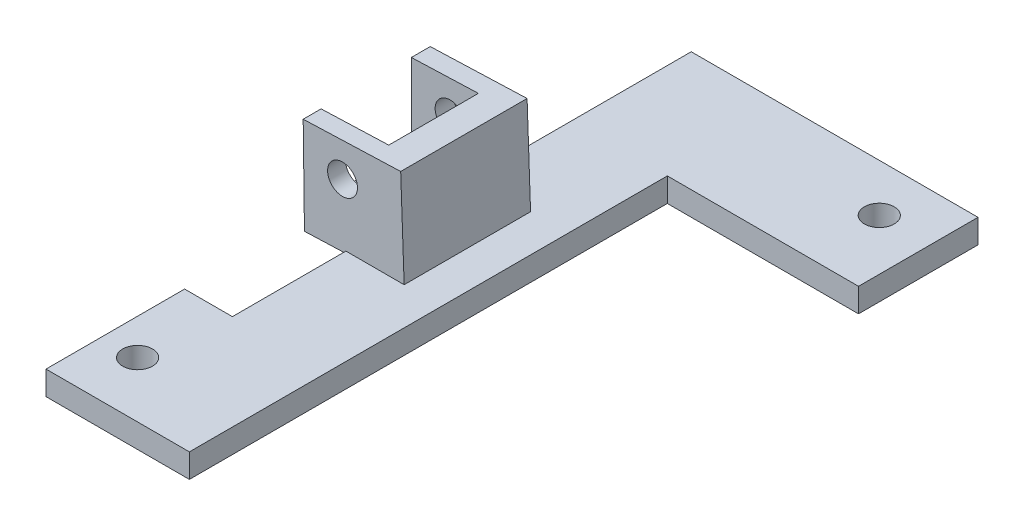
ISO-10303-21;
HEADER;
FILE_DESCRIPTION(('STEP AP214'),'2;1');
FILE_NAME('part.step','',(''),(''),'','','');
FILE_SCHEMA(('AUTOMOTIVE_DESIGN { 1 0 10303 214 1 1 1 1 }'));
ENDSEC;
DATA;
#1=APPLICATION_CONTEXT('core data for automotive mechanical design processes');
#2=APPLICATION_PROTOCOL_DEFINITION('international standard','automotive_design',2000,#1);
#3=PRODUCT_CONTEXT('',#1,'mechanical');
#4=PRODUCT('Part','Part','',(#3));
#5=PRODUCT_RELATED_PRODUCT_CATEGORY('part','',(#4));
#6=PRODUCT_DEFINITION_FORMATION('','',#4);
#7=PRODUCT_DEFINITION_CONTEXT('part definition',#1,'design');
#8=PRODUCT_DEFINITION('design','',#6,#7);
#9=PRODUCT_DEFINITION_SHAPE('','',#8);
#10=(LENGTH_UNIT() NAMED_UNIT(*) SI_UNIT(.MILLI.,.METRE.));
#11=(NAMED_UNIT(*) PLANE_ANGLE_UNIT() SI_UNIT($,.RADIAN.));
#12=(NAMED_UNIT(*) SI_UNIT($,.STERADIAN.) SOLID_ANGLE_UNIT());
#13=UNCERTAINTY_MEASURE_WITH_UNIT(LENGTH_MEASURE(1.E-05),#10,'distance_accuracy_value','');
#14=(GEOMETRIC_REPRESENTATION_CONTEXT(3) GLOBAL_UNCERTAINTY_ASSIGNED_CONTEXT((#13)) GLOBAL_UNIT_ASSIGNED_CONTEXT((#10,
#11,#12)) REPRESENTATION_CONTEXT('',''));
#15=CARTESIAN_POINT('',(0.,0.,0.));
#16=DIRECTION('',(0.,0.,1.));
#17=DIRECTION('',(1.,0.,0.));
#18=AXIS2_PLACEMENT_3D('',#15,#16,#17);
#19=CARTESIAN_POINT('',(346.144684743953,110.000000000002,-23.061761583511));
#20=DIRECTION('',(0.,0.,1.));
#21=DIRECTION('',(1.,0.,0.));
#22=AXIS2_PLACEMENT_3D('',#19,#20,#21);
#23=CYLINDRICAL_SURFACE('',#22,9.525);
#24=DIRECTION('',(0.,0.,1.));
#25=VECTOR('',#24,1.);
#26=CARTESIAN_POINT('',(352.162161706517,117.383467749306,-23.061761583511));
#27=LINE('',#26,#25);
#28=CARTESIAN_POINT('',(352.162161706517,117.383467749306,-19.0500000000003));
#29=VERTEX_POINT('',#28);
#30=CARTESIAN_POINT('',(352.162161706517,117.383467749306,0.));
#31=VERTEX_POINT('',#30);
#32=EDGE_CURVE('E328',#29,#31,#27,.T.);
#33=ORIENTED_EDGE('',*,*,#32,.F.);
#34=CARTESIAN_POINT('',(346.144684743953,110.000000000002,-19.0500000000003));
#35=DIRECTION('',(0.,0.,1.));
#36=DIRECTION('',(1.,0.,0.));
#37=AXIS2_PLACEMENT_3D('',#34,#35,#36);
#38=CIRCLE('',#37,9.525);
#39=CARTESIAN_POINT('',(346.486451601042,100.48113344902,-19.0500000000003));
#40=VERTEX_POINT('',#39);
#41=EDGE_CURVE('E297',#40,#29,#38,.T.);
#42=ORIENTED_EDGE('',*,*,#41,.F.);
#43=DIRECTION('',(0.,0.,1.));
#44=VECTOR('',#43,1.);
#45=CARTESIAN_POINT('',(346.486451601042,100.48113344902,-23.061761583511));
#46=LINE('',#45,#44);
#47=CARTESIAN_POINT('',(346.486451601042,100.48113344902,0.));
#48=VERTEX_POINT('',#47);
#49=EDGE_CURVE('E320',#40,#48,#46,.T.);
#50=ORIENTED_EDGE('',*,*,#49,.T.);
#51=CARTESIAN_POINT('',(346.144684743953,110.000000000002,0.));
#52=DIRECTION('',(0.,0.,1.));
#53=DIRECTION('',(1.,0.,0.));
#54=AXIS2_PLACEMENT_3D('',#51,#52,#53);
#55=CIRCLE('',#54,9.525);
#56=EDGE_CURVE('E296',#48,#31,#55,.T.);
#57=ORIENTED_EDGE('',*,*,#56,.T.);
#58=EDGE_LOOP('',(#33,#42,#50,#57));
#59=FACE_BOUND('',#58,.T.);
#60=ADVANCED_FACE('F41',(#59),#23,.F.);
#61=CARTESIAN_POINT('',(-3.75573745735037,104.604536441931,-23.061761583511));
#62=DIRECTION('',(-0.0358810348650173,0.999356068344519,0.));
#63=DIRECTION('',(-0.999356068344519,-0.0358810348650173,0.));
#64=AXIS2_PLACEMENT_3D('',#61,#62,#63);
#65=PLANE('',#64);
#66=ORIENTED_EDGE('',*,*,#32,.T.);
#67=DIRECTION('',(-0.999356068344519,-0.0358810348650153,0.));
#68=VECTOR('',#67,1.);
#69=CARTESIAN_POINT('',(358.508072740506,117.611312320699,0.));
#70=LINE('',#69,#68);
#71=CARTESIAN_POINT('',(337.780813741455,116.867117607364,0.));
#72=VERTEX_POINT('',#71);
#73=EDGE_CURVE('E261',#31,#72,#70,.T.);
#74=ORIENTED_EDGE('',*,*,#73,.T.);
#75=DIRECTION('',(0.,0.,-1.));
#76=VECTOR('',#75,1.);
#77=CARTESIAN_POINT('',(337.780813741455,116.867117607364,3.81));
#78=LINE('',#77,#76);
#79=CARTESIAN_POINT('',(337.780813741455,116.867117607364,3.81));
#80=VERTEX_POINT('',#79);
#81=EDGE_CURVE('E283',#80,#72,#78,.T.);
#82=ORIENTED_EDGE('',*,*,#81,.F.);
#83=DIRECTION('',(-0.999356068344519,-0.0358810348650153,0.));
#84=VECTOR('',#83,1.);
#85=CARTESIAN_POINT('',(358.508072740506,117.611312320699,3.81));
#86=LINE('',#85,#84);
#87=CARTESIAN_POINT('',(358.508072740506,117.611312320699,3.81));
#88=VERTEX_POINT('',#87);
#89=EDGE_CURVE('E264',#88,#80,#86,.T.);
#90=ORIENTED_EDGE('',*,*,#89,.F.);
#91=DIRECTION('',(0.,0.,1.));
#92=VECTOR('',#91,1.);
#93=CARTESIAN_POINT('',(358.508072740504,117.611312320699,-23.061761583511));
#94=LINE('',#93,#92);
#95=CARTESIAN_POINT('',(358.508072740504,117.611312320699,-23.061761583511));
#96=VERTEX_POINT('',#95);
#97=EDGE_CURVE('E330',#96,#88,#94,.T.);
#98=ORIENTED_EDGE('',*,*,#97,.F.);
#99=DIRECTION('',(-0.999356068344519,-0.0358810348650173,0.));
#100=VECTOR('',#99,1.);
#101=CARTESIAN_POINT('',(-3.75573745735037,104.604536441931,-23.061761583511));
#102=LINE('',#101,#100);
#103=CARTESIAN_POINT('',(337.915550260548,116.871955208187,-23.061761583511));
#104=VERTEX_POINT('',#103);
#105=EDGE_CURVE('E318',#96,#104,#102,.T.);
#106=ORIENTED_EDGE('',*,*,#105,.T.);
#107=DIRECTION('',(0.,0.,-1.));
#108=VECTOR('',#107,1.);
#109=CARTESIAN_POINT('',(337.915550260548,116.871955208187,5.67641578914084));
#110=LINE('',#109,#108);
#111=CARTESIAN_POINT('',(337.915550260548,116.871955208187,-19.0500000000003));
#112=VERTEX_POINT('',#111);
#113=EDGE_CURVE('E286',#112,#104,#110,.T.);
#114=ORIENTED_EDGE('',*,*,#113,.F.);
#115=DIRECTION('',(-0.999356068344519,-0.0358810348650149,0.));
#116=VECTOR('',#115,1.);
#117=CARTESIAN_POINT('',(-3.75573745735016,104.604536441932,-19.0500000000003));
#118=LINE('',#117,#116);
#119=EDGE_CURVE('E292',#29,#112,#118,.T.);
#120=ORIENTED_EDGE('',*,*,#119,.F.);
#121=EDGE_LOOP('',(#66,#74,#82,#90,#98,#106,#114,#120));
#122=FACE_BOUND('',#121,.T.);
#123=ADVANCED_FACE('F416',(#122),#65,.T.);
#124=CARTESIAN_POINT('',(362.263810197855,13.0067758787662,-23.061761583511));
#125=DIRECTION('',(0.999356068344519,0.0358810348650144,0.));
#126=DIRECTION('',(-0.0358810348650144,0.99935606834452,0.));
#127=AXIS2_PLACEMENT_3D('',#124,#125,#126);
#128=PLANE('',#127);
#129=ORIENTED_EDGE('',*,*,#97,.T.);
#130=DIRECTION('',(-0.0358810348650144,0.999356068344519,0.));
#131=VECTOR('',#130,1.);
#132=CARTESIAN_POINT('',(359.243555016962,97.1267115029865,3.81));
#133=LINE('',#132,#131);
#134=CARTESIAN_POINT('',(359.243555016962,97.1267115029865,3.81));
#135=VERTEX_POINT('',#134);
#136=EDGE_CURVE('E273',#135,#88,#133,.T.);
#137=ORIENTED_EDGE('',*,*,#136,.F.);
#138=DIRECTION('',(0.,0.,1.));
#139=VECTOR('',#138,1.);
#140=CARTESIAN_POINT('',(359.243555016961,97.1267115029865,-23.061761583511));
#141=LINE('',#140,#139);
#142=CARTESIAN_POINT('',(359.243555016961,97.1267115029865,-23.061761583511));
#143=VERTEX_POINT('',#142);
#144=EDGE_CURVE('E332',#143,#135,#141,.T.);
#145=ORIENTED_EDGE('',*,*,#144,.F.);
#146=DIRECTION('',(-0.0358810348650144,0.999356068344519,0.));
#147=VECTOR('',#146,1.);
#148=CARTESIAN_POINT('',(362.263810197855,13.0067758787662,-23.061761583511));
#149=LINE('',#148,#147);
#150=EDGE_CURVE('E315',#143,#96,#149,.T.);
#151=ORIENTED_EDGE('',*,*,#150,.T.);
#152=EDGE_LOOP('',(#129,#137,#145,#151));
#153=FACE_BOUND('',#152,.T.);
#154=ADVANCED_FACE('F422',(#153),#128,.T.);
#155=CARTESIAN_POINT('',(-3.02025518089423,84.1199356242191,-23.061761583511));
#156=DIRECTION('',(0.0358810348650174,-0.999356068344519,0.));
#157=DIRECTION('',(0.999356068344519,0.0358810348650174,0.));
#158=AXIS2_PLACEMENT_3D('',#155,#156,#157);
#159=PLANE('',#158);
#160=DIRECTION('',(0.,0.,-1.));
#161=VECTOR('',#160,1.);
#162=CARTESIAN_POINT('',(346.864506182946,96.6822522187748,-23.0617615835113));
#163=LINE('',#162,#161);
#164=CARTESIAN_POINT('',(346.864506182946,96.6822522187747,3.81));
#165=VERTEX_POINT('',#164);
#166=CARTESIAN_POINT('',(346.864506182946,96.6822522187748,-23.061761583511));
#167=VERTEX_POINT('',#166);
#168=EDGE_CURVE('E253',#165,#167,#163,.T.);
#169=ORIENTED_EDGE('',*,*,#168,.F.);
#170=DIRECTION('',(0.999356068344519,0.0358810348650187,0.));
#171=VECTOR('',#170,1.);
#172=CARTESIAN_POINT('',(338.052257003384,96.3658558610933,3.81));
#173=LINE('',#172,#171);
#174=CARTESIAN_POINT('',(338.052257003384,96.3658558610933,3.81));
#175=VERTEX_POINT('',#174);
#176=EDGE_CURVE('E270',#175,#165,#173,.T.);
#177=ORIENTED_EDGE('',*,*,#176,.F.);
#178=DIRECTION('',(0.,0.,-1.));
#179=VECTOR('',#178,1.);
#180=CARTESIAN_POINT('',(338.052257003384,96.3658558610933,3.81));
#181=LINE('',#180,#179);
#182=CARTESIAN_POINT('',(338.052257003384,96.3658558610933,0.));
#183=VERTEX_POINT('',#182);
#184=EDGE_CURVE('E276',#175,#183,#181,.T.);
#185=ORIENTED_EDGE('',*,*,#184,.T.);
#186=DIRECTION('',(0.,0.,1.));
#187=VECTOR('',#186,1.);
#188=CARTESIAN_POINT('',(338.052257003383,96.3658558610933,-23.061761583511));
#189=LINE('',#188,#187);
#190=CARTESIAN_POINT('',(338.052257003383,96.3658558610933,-23.061761583511));
#191=VERTEX_POINT('',#190);
#192=EDGE_CURVE('E335',#191,#183,#189,.T.);
#193=ORIENTED_EDGE('',*,*,#192,.F.);
#194=DIRECTION('',(0.999356068344519,0.0358810348650174,0.));
#195=VECTOR('',#194,1.);
#196=CARTESIAN_POINT('',(-3.02025518089423,84.1199356242191,-23.061761583511));
#197=LINE('',#196,#195);
#198=EDGE_CURVE('E312',#191,#167,#197,.T.);
#199=ORIENTED_EDGE('',*,*,#198,.T.);
#200=EDGE_LOOP('',(#169,#177,#185,#193,#199));
#201=FACE_BOUND('',#200,.T.);
#202=ADVANCED_FACE('F353',(#201),#159,.T.);
#203=CARTESIAN_POINT('',(341.072512184277,12.245920236874,-23.061761583511));
#204=DIRECTION('',(-0.999356068344519,-0.0358810348650171,0.));
#205=DIRECTION('',(0.0358810348650171,-0.999356068344519,0.));
#206=AXIS2_PLACEMENT_3D('',#203,#204,#205);
#207=PLANE('',#206);
#208=DIRECTION('',(0.0358810348650171,-0.999356068344519,0.));
#209=VECTOR('',#208,1.);
#210=CARTESIAN_POINT('',(341.072512184277,12.245920236874,0.));
#211=LINE('',#210,#209);
#212=CARTESIAN_POINT('',(337.915550260547,100.173402481486,0.));
#213=VERTEX_POINT('',#212);
#214=EDGE_CURVE('E313',#213,#183,#211,.T.);
#215=ORIENTED_EDGE('',*,*,#214,.F.);
#216=DIRECTION('',(0.,0.,1.));
#217=VECTOR('',#216,1.);
#218=CARTESIAN_POINT('',(337.915550260547,100.173402481486,-23.061761583511));
#219=LINE('',#218,#217);
#220=CARTESIAN_POINT('',(337.915550260547,100.173402481486,-19.0500000000003));
#221=VERTEX_POINT('',#220);
#222=EDGE_CURVE('E340',#221,#213,#219,.T.);
#223=ORIENTED_EDGE('',*,*,#222,.F.);
#224=CARTESIAN_POINT('',(337.915550260547,100.173402481486,-23.061761583511));
#225=VERTEX_POINT('',#224);
#226=EDGE_CURVE('E338',#225,#221,#219,.T.);
#227=ORIENTED_EDGE('',*,*,#226,.F.);
#228=DIRECTION('',(0.0358810348650171,-0.999356068344519,0.));
#229=VECTOR('',#228,1.);
#230=CARTESIAN_POINT('',(341.072512184277,12.245920236874,-23.061761583511));
#231=LINE('',#230,#229);
#232=EDGE_CURVE('E309',#225,#191,#231,.T.);
#233=ORIENTED_EDGE('',*,*,#232,.T.);
#234=ORIENTED_EDGE('',*,*,#192,.T.);
#235=EDGE_LOOP('',(#215,#223,#227,#233,#234));
#236=FACE_BOUND('',#235,.T.);
#237=ADVANCED_FACE('F442',(#236),#207,.T.);
#238=CARTESIAN_POINT('',(-3.15696192372979,87.9274822446124,-23.061761583511));
#239=DIRECTION('',(0.0358810348650153,-0.999356068344519,0.));
#240=DIRECTION('',(0.999356068344519,0.0358810348650153,0.));
#241=AXIS2_PLACEMENT_3D('',#238,#239,#240);
#242=PLANE('',#241);
#243=ORIENTED_EDGE('',*,*,#49,.F.);
#244=DIRECTION('',(0.999356068344519,0.0358810348650153,0.));
#245=VECTOR('',#244,1.);
#246=CARTESIAN_POINT('',(-3.15696192372979,87.9274822446124,-19.0500000000003));
#247=LINE('',#246,#245);
#248=EDGE_CURVE('E300',#221,#40,#247,.T.);
#249=ORIENTED_EDGE('',*,*,#248,.F.);
#250=ORIENTED_EDGE('',*,*,#222,.T.);
#251=DIRECTION('',(0.999356068344519,0.0358810348650153,0.));
#252=VECTOR('',#251,1.);
#253=CARTESIAN_POINT('',(-3.15696192372979,87.9274822446124,0.));
#254=LINE('',#253,#252);
#255=CARTESIAN_POINT('',(338.001802865479,100.176499308355,0.));
#256=VERTEX_POINT('',#255);
#257=EDGE_CURVE('E324',#213,#256,#254,.T.);
#258=ORIENTED_EDGE('',*,*,#257,.T.);
#259=EDGE_CURVE('E323',#256,#48,#254,.T.);
#260=ORIENTED_EDGE('',*,*,#259,.T.);
#261=EDGE_LOOP('',(#243,#249,#250,#258,#260));
#262=FACE_BOUND('',#261,.T.);
#263=ADVANCED_FACE('F438',(#262),#242,.F.);
#264=CARTESIAN_POINT('',(0.,0.,-23.061761583511));
#265=DIRECTION('',(0.,0.,1.));
#266=DIRECTION('',(1.,0.,0.));
#267=AXIS2_PLACEMENT_3D('',#264,#265,#266);
#268=PLANE('',#267);
#269=DIRECTION('',(1.,0.,0.));
#270=VECTOR('',#269,1.);
#271=CARTESIAN_POINT('',(0.,97.1267115029864,-23.061761583511));
#272=LINE('',#271,#270);
#273=CARTESIAN_POINT('',(346.864506182946,97.1267115029865,-23.061761583511));
#274=VERTEX_POINT('',#273);
#275=EDGE_CURVE('E55',#274,#143,#272,.T.);
#276=ORIENTED_EDGE('',*,*,#275,.F.);
#277=DIRECTION('',(0.,-1.,0.));
#278=VECTOR('',#277,1.);
#279=CARTESIAN_POINT('',(346.864506182946,0.,-23.061761583511));
#280=LINE('',#279,#278);
#281=EDGE_CURVE('E59',#274,#167,#280,.T.);
#282=ORIENTED_EDGE('',*,*,#281,.T.);
#283=ORIENTED_EDGE('',*,*,#198,.F.);
#284=ORIENTED_EDGE('',*,*,#232,.F.);
#285=DIRECTION('',(0.,-1.,0.));
#286=VECTOR('',#285,1.);
#287=CARTESIAN_POINT('',(337.915550260548,0.,-23.061761583511));
#288=LINE('',#287,#286);
#289=EDGE_CURVE('E287',#104,#225,#288,.T.);
#290=ORIENTED_EDGE('',*,*,#289,.F.);
#291=ORIENTED_EDGE('',*,*,#105,.F.);
#292=ORIENTED_EDGE('',*,*,#150,.F.);
#293=EDGE_LOOP('',(#276,#282,#283,#284,#290,#291,#292));
#294=FACE_BOUND('',#293,.T.);
#295=CARTESIAN_POINT('',(346.144684743953,110.000000000002,-23.061761583511));
#296=DIRECTION('',(0.,0.,-1.));
#297=DIRECTION('',(-1.,0.,0.));
#298=AXIS2_PLACEMENT_3D('',#295,#296,#297);
#299=CIRCLE('',#298,3.17499999999986);
#300=CARTESIAN_POINT('',(342.969684743953,110.000000000002,-23.061761583511));
#301=VERTEX_POINT('',#300);
#302=EDGE_CURVE('E289',#301,#301,#299,.T.);
#303=ORIENTED_EDGE('',*,*,#302,.F.);
#304=EDGE_LOOP('',(#303));
#305=FACE_BOUND('',#304,.T.);
#306=ADVANCED_FACE('F453',(#294,#305),#268,.F.);
#307=CARTESIAN_POINT('',(0.,0.,0.));
#308=DIRECTION('',(0.,0.,1.));
#309=DIRECTION('',(1.,0.,0.));
#310=AXIS2_PLACEMENT_3D('',#307,#308,#309);
#311=PLANE('',#310);
#312=DIRECTION('',(0.0132391594034909,-0.999912358488627,0.));
#313=VECTOR('',#312,1.);
#314=CARTESIAN_POINT('',(337.780813741455,116.867117607364,0.));
#315=LINE('',#314,#313);
#316=EDGE_CURVE('E280',#256,#183,#315,.T.);
#317=ORIENTED_EDGE('',*,*,#316,.F.);
#318=ORIENTED_EDGE('',*,*,#257,.F.);
#319=ORIENTED_EDGE('',*,*,#214,.T.);
#320=EDGE_LOOP('',(#317,#318,#319));
#321=FACE_BOUND('',#320,.T.);
#322=ADVANCED_FACE('F444',(#321),#311,.T.);
#323=CARTESIAN_POINT('',(337.915550260548,0.,5.67641578914084));
#324=DIRECTION('',(1.,0.,0.));
#325=DIRECTION('',(0.,0.,-1.));
#326=AXIS2_PLACEMENT_3D('',#323,#324,#325);
#327=PLANE('',#326);
#328=DIRECTION('',(0.,-1.,0.));
#329=VECTOR('',#328,1.);
#330=CARTESIAN_POINT('',(337.915550260548,0.,-19.0500000000003));
#331=LINE('',#330,#329);
#332=EDGE_CURVE('E302',#112,#221,#331,.T.);
#333=ORIENTED_EDGE('',*,*,#332,.F.);
#334=ORIENTED_EDGE('',*,*,#113,.T.);
#335=ORIENTED_EDGE('',*,*,#289,.T.);
#336=ORIENTED_EDGE('',*,*,#226,.T.);
#337=EDGE_LOOP('',(#333,#334,#335,#336));
#338=FACE_BOUND('',#337,.T.);
#339=ADVANCED_FACE('F456',(#338),#327,.F.);
#340=CARTESIAN_POINT('',(346.144684743953,110.000000000002,5.67641578914084));
#341=DIRECTION('',(0.,0.,-1.));
#342=DIRECTION('',(-1.,0.,0.));
#343=AXIS2_PLACEMENT_3D('',#340,#341,#342);
#344=CYLINDRICAL_SURFACE('',#343,3.17499999999986);
#345=ORIENTED_EDGE('',*,*,#302,.T.);
#346=EDGE_LOOP('',(#345));
#347=FACE_BOUND('',#346,.T.);
#348=CARTESIAN_POINT('',(346.144684743953,110.000000000002,-19.0500000000003));
#349=DIRECTION('',(0.,0.,1.));
#350=DIRECTION('',(1.,0.,0.));
#351=AXIS2_PLACEMENT_3D('',#348,#349,#350);
#352=CIRCLE('',#351,3.17499999999986);
#353=CARTESIAN_POINT('',(349.319684743953,110.000000000002,-19.0500000000003));
#354=VERTEX_POINT('',#353);
#355=EDGE_CURVE('E293',#354,#354,#352,.F.);
#356=ORIENTED_EDGE('',*,*,#355,.F.);
#357=EDGE_LOOP('',(#356));
#358=FACE_BOUND('',#357,.T.);
#359=ADVANCED_FACE('F458',(#347,#358),#344,.F.);
#360=CARTESIAN_POINT('',(314.158120897483,116.018964789375,-19.0500000000003));
#361=DIRECTION('',(0.,0.,1.));
#362=DIRECTION('',(1.,0.,0.));
#363=AXIS2_PLACEMENT_3D('',#360,#361,#362);
#364=PLANE('',#363);
#365=ORIENTED_EDGE('',*,*,#119,.T.);
#366=ORIENTED_EDGE('',*,*,#332,.T.);
#367=ORIENTED_EDGE('',*,*,#248,.T.);
#368=ORIENTED_EDGE('',*,*,#41,.T.);
#369=EDGE_LOOP('',(#365,#366,#367,#368));
#370=FACE_BOUND('',#369,.T.);
#371=ORIENTED_EDGE('',*,*,#355,.T.);
#372=EDGE_LOOP('',(#371));
#373=FACE_BOUND('',#372,.T.);
#374=ADVANCED_FACE('F433',(#370,#373),#364,.T.);
#375=CARTESIAN_POINT('',(0.,0.,0.));
#376=DIRECTION('',(0.,0.,-1.));
#377=DIRECTION('',(-1.,0.,0.));
#378=AXIS2_PLACEMENT_3D('',#375,#376,#377);
#379=PLANE('',#378);
#380=CARTESIAN_POINT('',(346.144684743953,110.000000000002,0.));
#381=DIRECTION('',(0.,0.,1.));
#382=DIRECTION('',(1.,0.,0.));
#383=AXIS2_PLACEMENT_3D('',#380,#381,#382);
#384=CIRCLE('',#383,3.17499999999997);
#385=CARTESIAN_POINT('',(342.969684743953,110.000000000002,0.));
#386=VERTEX_POINT('',#385);
#387=EDGE_CURVE('E257',#386,#386,#384,.T.);
#388=ORIENTED_EDGE('',*,*,#387,.T.);
#389=EDGE_LOOP('',(#388));
#390=FACE_BOUND('',#389,.T.);
#391=ORIENTED_EDGE('',*,*,#56,.F.);
#392=ORIENTED_EDGE('',*,*,#259,.F.);
#393=EDGE_CURVE('E268',#72,#256,#315,.T.);
#394=ORIENTED_EDGE('',*,*,#393,.F.);
#395=ORIENTED_EDGE('',*,*,#73,.F.);
#396=EDGE_LOOP('',(#391,#392,#394,#395));
#397=FACE_BOUND('',#396,.T.);
#398=ADVANCED_FACE('F447',(#390,#397),#379,.T.);
#399=CARTESIAN_POINT('',(0.,0.,3.81));
#400=DIRECTION('',(0.,0.,-1.));
#401=DIRECTION('',(-1.,0.,0.));
#402=AXIS2_PLACEMENT_3D('',#399,#400,#401);
#403=PLANE('',#402);
#404=ORIENTED_EDGE('',*,*,#176,.T.);
#405=DIRECTION('',(0.,1.,0.));
#406=VECTOR('',#405,1.);
#407=CARTESIAN_POINT('',(346.864506182946,0.,3.81));
#408=LINE('',#407,#406);
#409=CARTESIAN_POINT('',(346.864506182946,97.1267115029865,3.81));
#410=VERTEX_POINT('',#409);
#411=EDGE_CURVE('E11',#165,#410,#408,.T.);
#412=ORIENTED_EDGE('',*,*,#411,.T.);
#413=DIRECTION('',(-1.,0.,0.));
#414=VECTOR('',#413,1.);
#415=CARTESIAN_POINT('',(0.,97.1267115029864,3.81));
#416=LINE('',#415,#414);
#417=EDGE_CURVE('E48',#135,#410,#416,.T.);
#418=ORIENTED_EDGE('',*,*,#417,.F.);
#419=ORIENTED_EDGE('',*,*,#136,.T.);
#420=ORIENTED_EDGE('',*,*,#89,.T.);
#421=DIRECTION('',(0.0132391594034909,-0.999912358488627,0.));
#422=VECTOR('',#421,1.);
#423=CARTESIAN_POINT('',(337.780813741455,116.867117607364,3.81));
#424=LINE('',#423,#422);
#425=EDGE_CURVE('E267',#80,#175,#424,.T.);
#426=ORIENTED_EDGE('',*,*,#425,.T.);
#427=EDGE_LOOP('',(#404,#412,#418,#419,#420,#426));
#428=FACE_BOUND('',#427,.T.);
#429=CARTESIAN_POINT('',(346.144684743953,110.000000000002,3.81));
#430=DIRECTION('',(0.,0.,1.));
#431=DIRECTION('',(1.,0.,0.));
#432=AXIS2_PLACEMENT_3D('',#429,#430,#431);
#433=CIRCLE('',#432,3.17499999999997);
#434=CARTESIAN_POINT('',(342.969684743953,110.000000000002,3.81));
#435=VERTEX_POINT('',#434);
#436=EDGE_CURVE('E258',#435,#435,#433,.T.);
#437=ORIENTED_EDGE('',*,*,#436,.F.);
#438=EDGE_LOOP('',(#437));
#439=FACE_BOUND('',#438,.T.);
#440=ADVANCED_FACE('F356',(#428,#439),#403,.F.);
#441=CARTESIAN_POINT('',(337.780813741455,116.867117607364,3.81));
#442=DIRECTION('',(0.999912358488627,0.0132391594034909,0.));
#443=DIRECTION('',(-0.0132391594034909,0.999912358488627,0.));
#444=AXIS2_PLACEMENT_3D('',#441,#442,#443);
#445=PLANE('',#444);
#446=ORIENTED_EDGE('',*,*,#393,.T.);
#447=ORIENTED_EDGE('',*,*,#316,.T.);
#448=ORIENTED_EDGE('',*,*,#184,.F.);
#449=ORIENTED_EDGE('',*,*,#425,.F.);
#450=ORIENTED_EDGE('',*,*,#81,.T.);
#451=EDGE_LOOP('',(#446,#447,#448,#449,#450));
#452=FACE_BOUND('',#451,.T.);
#453=ADVANCED_FACE('F347',(#452),#445,.F.);
#454=CARTESIAN_POINT('',(346.144684743953,110.000000000002,3.81));
#455=DIRECTION('',(0.,0.,-1.));
#456=DIRECTION('',(-1.,0.,0.));
#457=AXIS2_PLACEMENT_3D('',#454,#455,#456);
#458=CYLINDRICAL_SURFACE('',#457,3.17499999999997);
#459=CARTESIAN_POINT('',(342.969684743953,110.000000000002,3.81));
#460=CARTESIAN_POINT('',(342.969684743953,110.000000000002,3.7703125));
#461=CARTESIAN_POINT('',(342.969684743953,110.000000000002,3.730625));
#462=CARTESIAN_POINT('',(342.969684743953,110.000000000002,3.65125));
#463=CARTESIAN_POINT('',(342.969684743953,110.000000000002,3.6115625));
#464=CARTESIAN_POINT('',(342.969684743953,110.000000000002,3.5321875));
#465=CARTESIAN_POINT('',(342.969684743953,110.000000000002,3.4925));
#466=CARTESIAN_POINT('',(342.969684743953,110.000000000002,3.413125));
#467=CARTESIAN_POINT('',(342.969684743953,110.000000000002,3.3734375));
#468=CARTESIAN_POINT('',(342.969684743953,110.000000000002,3.2940625));
#469=CARTESIAN_POINT('',(342.969684743953,110.000000000002,3.254375));
#470=CARTESIAN_POINT('',(342.969684743953,110.000000000002,3.175));
#471=CARTESIAN_POINT('',(342.969684743953,110.000000000002,3.1353125));
#472=CARTESIAN_POINT('',(342.969684743953,110.000000000002,3.0559375));
#473=CARTESIAN_POINT('',(342.969684743953,110.000000000002,3.01625));
#474=CARTESIAN_POINT('',(342.969684743953,110.000000000002,2.936875));
#475=CARTESIAN_POINT('',(342.969684743953,110.000000000002,2.8971875));
#476=CARTESIAN_POINT('',(342.969684743953,110.000000000002,2.8178125));
#477=CARTESIAN_POINT('',(342.969684743953,110.000000000002,2.778125));
#478=CARTESIAN_POINT('',(342.969684743953,110.000000000002,2.69875));
#479=CARTESIAN_POINT('',(342.969684743953,110.000000000002,2.6590625));
#480=CARTESIAN_POINT('',(342.969684743953,110.000000000002,2.5796875));
#481=CARTESIAN_POINT('',(342.969684743953,110.000000000002,2.54));
#482=CARTESIAN_POINT('',(342.969684743953,110.000000000002,2.460625));
#483=CARTESIAN_POINT('',(342.969684743953,110.000000000002,2.4209375));
#484=CARTESIAN_POINT('',(342.969684743953,110.000000000002,2.3415625));
#485=CARTESIAN_POINT('',(342.969684743953,110.000000000002,2.301875));
#486=CARTESIAN_POINT('',(342.969684743953,110.000000000002,2.2225));
#487=CARTESIAN_POINT('',(342.969684743953,110.000000000002,2.1828125));
#488=CARTESIAN_POINT('',(342.969684743953,110.000000000002,2.1034375));
#489=CARTESIAN_POINT('',(342.969684743953,110.000000000002,2.06375));
#490=CARTESIAN_POINT('',(342.969684743953,110.000000000002,1.984375));
#491=CARTESIAN_POINT('',(342.969684743953,110.000000000002,1.9446875));
#492=CARTESIAN_POINT('',(342.969684743953,110.000000000002,1.8653125));
#493=CARTESIAN_POINT('',(342.969684743953,110.000000000002,1.825625));
#494=CARTESIAN_POINT('',(342.969684743953,110.000000000002,1.74625));
#495=CARTESIAN_POINT('',(342.969684743953,110.000000000002,1.7065625));
#496=CARTESIAN_POINT('',(342.969684743953,110.000000000002,1.6271875));
#497=CARTESIAN_POINT('',(342.969684743953,110.000000000002,1.5875));
#498=CARTESIAN_POINT('',(342.969684743953,110.000000000002,1.508125));
#499=CARTESIAN_POINT('',(342.969684743953,110.000000000002,1.4684375));
#500=CARTESIAN_POINT('',(342.969684743953,110.000000000002,1.3890625));
#501=CARTESIAN_POINT('',(342.969684743953,110.000000000002,1.349375));
#502=CARTESIAN_POINT('',(342.969684743953,110.000000000002,1.27));
#503=CARTESIAN_POINT('',(342.969684743953,110.000000000002,1.2303125));
#504=CARTESIAN_POINT('',(342.969684743953,110.000000000002,1.1509375));
#505=CARTESIAN_POINT('',(342.969684743953,110.000000000002,1.11125));
#506=CARTESIAN_POINT('',(342.969684743953,110.000000000002,1.031875));
#507=CARTESIAN_POINT('',(342.969684743953,110.000000000002,0.9921875));
#508=CARTESIAN_POINT('',(342.969684743953,110.000000000002,0.9128125));
#509=CARTESIAN_POINT('',(342.969684743953,110.000000000002,0.873125));
#510=CARTESIAN_POINT('',(342.969684743953,110.000000000002,0.79375));
#511=CARTESIAN_POINT('',(342.969684743953,110.000000000002,0.7540625));
#512=CARTESIAN_POINT('',(342.969684743953,110.000000000002,0.6746875));
#513=CARTESIAN_POINT('',(342.969684743953,110.000000000002,0.635));
#514=CARTESIAN_POINT('',(342.969684743953,110.000000000002,0.555625));
#515=CARTESIAN_POINT('',(342.969684743953,110.000000000002,0.5159375));
#516=CARTESIAN_POINT('',(342.969684743953,110.000000000002,0.4365625));
#517=CARTESIAN_POINT('',(342.969684743953,110.000000000002,0.396875));
#518=CARTESIAN_POINT('',(342.969684743953,110.000000000002,0.3175));
#519=CARTESIAN_POINT('',(342.969684743953,110.000000000002,0.2778125));
#520=CARTESIAN_POINT('',(342.969684743953,110.000000000002,0.1984375));
#521=CARTESIAN_POINT('',(342.969684743953,110.000000000002,0.15875));
#522=CARTESIAN_POINT('',(342.969684743953,110.000000000002,0.0793749999999999));
#523=CARTESIAN_POINT('',(342.969684743953,110.000000000002,0.0396874999999999));
#524=CARTESIAN_POINT('',(342.969684743953,110.000000000002,0.));
#525=B_SPLINE_CURVE_WITH_KNOTS('',3,(#459,#460,#461,#462,#463,#464,#465,#466,#467,#468,#469,
#470,#471,#472,#473,#474,#475,#476,#477,#478,#479,#480,#481,#482,#483,#484,#485,#486,#487,#488,
#489,#490,#491,#492,#493,#494,#495,#496,#497,#498,#499,#500,#501,#502,#503,#504,#505,#506,#507,
#508,#509,#510,#511,#512,#513,#514,#515,#516,#517,#518,#519,#520,#521,#522,#523,#524),
.UNSPECIFIED.,.F.,.F.,(4,2,2,2,2,2,2,2,2,2,2,2,2,2,2,2,2,2,2,2,2,2,2,2,2,2,2,2,2,2,2,2,4),(0.,
0.1190625,0.238125,0.3571875,0.47625,0.595312499999999,0.714375,0.833437499999999,
0.952499999999999,1.0715625,1.190625,1.3096875,1.42875,1.5478125,1.666875,1.7859375,1.905,
2.0240625,2.143125,2.2621875,2.38125,2.5003125,2.619375,2.7384375,2.8575,2.9765625,3.095625,
3.2146875,3.33375,3.4528125,3.571875,3.6909375,3.81),.UNSPECIFIED.);
#526=EDGE_CURVE('BSEAM506',#435,#386,#525,.T.);
#527=ORIENTED_EDGE('',*,*,#436,.T.);
#528=ORIENTED_EDGE('',*,*,#387,.F.);
#529=ORIENTED_EDGE('',*,*,#526,.T.);
#530=ORIENTED_EDGE('',*,*,#526,.F.);
#531=EDGE_LOOP('',(#527,#529,#528,#530));
#532=FACE_BOUND('',#531,.T.);
#533=ADVANCED_FACE('F506',(#532),#458,.F.);
#534=CARTESIAN_POINT('',(346.864506182946,92.0467115029864,-44.958));
#535=DIRECTION('',(-1.,0.,0.));
#536=DIRECTION('',(0.,0.,1.));
#537=AXIS2_PLACEMENT_3D('',#534,#535,#536);
#538=PLANE('',#537);
#539=ORIENTED_EDGE('',*,*,#281,.F.);
#540=DIRECTION('',(0.,0.,1.));
#541=VECTOR('',#540,1.);
#542=CARTESIAN_POINT('',(346.864506182946,97.1267115029864,-44.958));
#543=LINE('',#542,#541);
#544=CARTESIAN_POINT('',(346.864506182946,97.1267115029864,-69.596));
#545=VERTEX_POINT('',#544);
#546=EDGE_CURVE('E217',#545,#274,#543,.T.);
#547=ORIENTED_EDGE('',*,*,#546,.F.);
#548=DIRECTION('',(0.,1.,0.));
#549=VECTOR('',#548,1.);
#550=CARTESIAN_POINT('',(346.864506182946,92.0467115029864,-69.596));
#551=LINE('',#550,#549);
#552=CARTESIAN_POINT('',(346.864506182946,92.0467115029864,-69.596));
#553=VERTEX_POINT('',#552);
#554=EDGE_CURVE('E180',#553,#545,#551,.T.);
#555=ORIENTED_EDGE('',*,*,#554,.F.);
#556=DIRECTION('',(0.,0.,1.));
#557=VECTOR('',#556,1.);
#558=CARTESIAN_POINT('',(346.864506182946,92.0467115029864,-44.958));
#559=LINE('',#558,#557);
#560=CARTESIAN_POINT('',(346.864506182946,92.0467115029866,27.94));
#561=VERTEX_POINT('',#560);
#562=EDGE_CURVE('E173',#553,#561,#559,.T.);
#563=ORIENTED_EDGE('',*,*,#562,.T.);
#564=DIRECTION('',(0.,1.,0.));
#565=VECTOR('',#564,1.);
#566=CARTESIAN_POINT('',(346.864506182946,92.0467115029866,27.94));
#567=LINE('',#566,#565);
#568=CARTESIAN_POINT('',(346.864506182946,97.1267115029866,27.94));
#569=VERTEX_POINT('',#568);
#570=EDGE_CURVE('E177',#561,#569,#567,.T.);
#571=ORIENTED_EDGE('',*,*,#570,.T.);
#572=EDGE_CURVE('E220',#410,#569,#543,.T.);
#573=ORIENTED_EDGE('',*,*,#572,.F.);
#574=ORIENTED_EDGE('',*,*,#411,.F.);
#575=ORIENTED_EDGE('',*,*,#168,.T.);
#576=EDGE_LOOP('',(#539,#547,#555,#563,#571,#573,#574,#575));
#577=FACE_BOUND('',#576,.T.);
#578=ADVANCED_FACE('F175',(#577),#538,.T.);
#579=CARTESIAN_POINT('',(0.,97.1267115029864,-2.18833329443828E-13));
#580=DIRECTION('',(0.,-1.,0.));
#581=DIRECTION('',(0.,0.,-1.));
#582=AXIS2_PLACEMENT_3D('',#579,#580,#581);
#583=PLANE('',#582);
#584=CARTESIAN_POINT('',(344.324506182946,97.1267115029866,45.5527908784176));
#585=DIRECTION('',(0.,1.,0.));
#586=DIRECTION('',(0.,0.,1.));
#587=AXIS2_PLACEMENT_3D('',#584,#585,#586);
#588=CIRCLE('',#587,3.17499999999997);
#589=CARTESIAN_POINT('',(344.324506182946,97.1267115029866,48.7277908784176));
#590=VERTEX_POINT('',#589);
#591=EDGE_CURVE('E367',#590,#590,#588,.T.);
#592=ORIENTED_EDGE('',*,*,#591,.F.);
#593=EDGE_LOOP('',(#592));
#594=FACE_BOUND('',#593,.T.);
#595=CARTESIAN_POINT('',(396.977487406266,97.1267115029864,-59.4567827712861));
#596=DIRECTION('',(0.,1.,0.));
#597=DIRECTION('',(0.,0.,1.));
#598=AXIS2_PLACEMENT_3D('',#595,#596,#597);
#599=CIRCLE('',#598,3.17499999999997);
#600=CARTESIAN_POINT('',(396.977487406266,97.1267115029864,-56.2817827712861));
#601=VERTEX_POINT('',#600);
#602=EDGE_CURVE('E360',#601,#601,#599,.T.);
#603=ORIENTED_EDGE('',*,*,#602,.F.);
#604=EDGE_LOOP('',(#603));
#605=FACE_BOUND('',#604,.T.);
#606=ORIENTED_EDGE('',*,*,#546,.T.);
#607=ORIENTED_EDGE('',*,*,#275,.T.);
#608=ORIENTED_EDGE('',*,*,#144,.T.);
#609=ORIENTED_EDGE('',*,*,#417,.T.);
#610=ORIENTED_EDGE('',*,*,#572,.T.);
#611=DIRECTION('',(-1.,0.,0.));
#612=VECTOR('',#611,1.);
#613=CARTESIAN_POINT('',(336.704506182946,97.1267115029866,27.94));
#614=LINE('',#613,#612);
#615=CARTESIAN_POINT('',(336.704506182946,97.1267115029866,27.94));
#616=VERTEX_POINT('',#615);
#617=EDGE_CURVE('E192',#569,#616,#614,.T.);
#618=ORIENTED_EDGE('',*,*,#617,.T.);
#619=DIRECTION('',(0.,0.,1.));
#620=VECTOR('',#619,1.);
#621=CARTESIAN_POINT('',(336.704506182946,97.1267115029866,57.404));
#622=LINE('',#621,#620);
#623=CARTESIAN_POINT('',(336.704506182946,97.1267115029866,57.404));
#624=VERTEX_POINT('',#623);
#625=EDGE_CURVE('E222',#616,#624,#622,.T.);
#626=ORIENTED_EDGE('',*,*,#625,.T.);
#627=DIRECTION('',(1.,0.,0.));
#628=VECTOR('',#627,1.);
#629=CARTESIAN_POINT('',(367.184506182946,97.1267115029866,57.404));
#630=LINE('',#629,#628);
#631=CARTESIAN_POINT('',(367.184506182946,97.1267115029866,57.404));
#632=VERTEX_POINT('',#631);
#633=EDGE_CURVE('E225',#624,#632,#630,.T.);
#634=ORIENTED_EDGE('',*,*,#633,.T.);
#635=DIRECTION('',(0.,0.,-1.));
#636=VECTOR('',#635,1.);
#637=CARTESIAN_POINT('',(367.184506182946,97.1267115029864,-44.196));
#638=LINE('',#637,#636);
#639=CARTESIAN_POINT('',(367.184506182946,97.1267115029864,-44.196));
#640=VERTEX_POINT('',#639);
#641=EDGE_CURVE('E228',#632,#640,#638,.T.);
#642=ORIENTED_EDGE('',*,*,#641,.T.);
#643=DIRECTION('',(1.,0.,0.));
#644=VECTOR('',#643,1.);
#645=CARTESIAN_POINT('',(407.824506182946,97.1267115029864,-44.196));
#646=LINE('',#645,#644);
#647=CARTESIAN_POINT('',(407.824506182946,97.1267115029864,-44.196));
#648=VERTEX_POINT('',#647);
#649=EDGE_CURVE('E231',#640,#648,#646,.T.);
#650=ORIENTED_EDGE('',*,*,#649,.T.);
#651=DIRECTION('',(0.,0.,-1.));
#652=VECTOR('',#651,1.);
#653=CARTESIAN_POINT('',(407.824506182946,97.1267115029864,-69.596));
#654=LINE('',#653,#652);
#655=CARTESIAN_POINT('',(407.824506182946,97.1267115029864,-69.596));
#656=VERTEX_POINT('',#655);
#657=EDGE_CURVE('E234',#648,#656,#654,.T.);
#658=ORIENTED_EDGE('',*,*,#657,.T.);
#659=DIRECTION('',(-1.,0.,0.));
#660=VECTOR('',#659,1.);
#661=CARTESIAN_POINT('',(346.864506182946,97.1267115029864,-69.596));
#662=LINE('',#661,#660);
#663=EDGE_CURVE('E186',#656,#545,#662,.T.);
#664=ORIENTED_EDGE('',*,*,#663,.T.);
#665=EDGE_LOOP('',(#606,#607,#608,#609,#610,#618,#626,#634,#642,#650,#658,#664));
#666=FACE_BOUND('',#665,.T.);
#667=ADVANCED_FACE('F381',(#594,#605,#666),#583,.F.);
#668=CARTESIAN_POINT('',(346.864506182946,92.0467115029864,-69.596));
#669=DIRECTION('',(0.,0.,-1.));
#670=DIRECTION('',(0.,1.,0.));
#671=AXIS2_PLACEMENT_3D('',#668,#669,#670);
#672=PLANE('',#671);
#673=ORIENTED_EDGE('',*,*,#663,.F.);
#674=DIRECTION('',(0.,1.,0.));
#675=VECTOR('',#674,1.);
#676=CARTESIAN_POINT('',(407.824506182946,92.0467115029864,-69.596));
#677=LINE('',#676,#675);
#678=CARTESIAN_POINT('',(407.824506182946,92.0467115029864,-69.596));
#679=VERTEX_POINT('',#678);
#680=EDGE_CURVE('E240',#679,#656,#677,.T.);
#681=ORIENTED_EDGE('',*,*,#680,.F.);
#682=DIRECTION('',(-1.,0.,0.));
#683=VECTOR('',#682,1.);
#684=CARTESIAN_POINT('',(346.864506182946,92.0467115029864,-69.596));
#685=LINE('',#684,#683);
#686=EDGE_CURVE('E194',#679,#553,#685,.T.);
#687=ORIENTED_EDGE('',*,*,#686,.T.);
#688=ORIENTED_EDGE('',*,*,#554,.T.);
#689=EDGE_LOOP('',(#673,#681,#687,#688));
#690=FACE_BOUND('',#689,.T.);
#691=ADVANCED_FACE('F384',(#690),#672,.T.);
#692=CARTESIAN_POINT('',(407.824506182946,92.0467115029864,-69.596));
#693=DIRECTION('',(1.,0.,0.));
#694=DIRECTION('',(0.,1.,0.));
#695=AXIS2_PLACEMENT_3D('',#692,#693,#694);
#696=PLANE('',#695);
#697=ORIENTED_EDGE('',*,*,#657,.F.);
#698=DIRECTION('',(0.,1.,0.));
#699=VECTOR('',#698,1.);
#700=CARTESIAN_POINT('',(407.824506182946,92.0467115029864,-44.196));
#701=LINE('',#700,#699);
#702=CARTESIAN_POINT('',(407.824506182946,92.0467115029864,-44.196));
#703=VERTEX_POINT('',#702);
#704=EDGE_CURVE('E242',#703,#648,#701,.T.);
#705=ORIENTED_EDGE('',*,*,#704,.F.);
#706=DIRECTION('',(0.,0.,-1.));
#707=VECTOR('',#706,1.);
#708=CARTESIAN_POINT('',(407.824506182946,92.0467115029864,-69.596));
#709=LINE('',#708,#707);
#710=EDGE_CURVE('E213',#703,#679,#709,.T.);
#711=ORIENTED_EDGE('',*,*,#710,.T.);
#712=ORIENTED_EDGE('',*,*,#680,.T.);
#713=EDGE_LOOP('',(#697,#705,#711,#712));
#714=FACE_BOUND('',#713,.T.);
#715=ADVANCED_FACE('F406',(#714),#696,.T.);
#716=CARTESIAN_POINT('',(407.824506182946,92.0467115029864,-44.196));
#717=DIRECTION('',(0.,0.,1.));
#718=DIRECTION('',(0.,-1.,0.));
#719=AXIS2_PLACEMENT_3D('',#716,#717,#718);
#720=PLANE('',#719);
#721=ORIENTED_EDGE('',*,*,#649,.F.);
#722=DIRECTION('',(0.,1.,0.));
#723=VECTOR('',#722,1.);
#724=CARTESIAN_POINT('',(367.184506182946,92.0467115029864,-44.196));
#725=LINE('',#724,#723);
#726=CARTESIAN_POINT('',(367.184506182946,92.0467115029864,-44.196));
#727=VERTEX_POINT('',#726);
#728=EDGE_CURVE('E244',#727,#640,#725,.T.);
#729=ORIENTED_EDGE('',*,*,#728,.F.);
#730=DIRECTION('',(1.,0.,0.));
#731=VECTOR('',#730,1.);
#732=CARTESIAN_POINT('',(407.824506182946,92.0467115029864,-44.196));
#733=LINE('',#732,#731);
#734=EDGE_CURVE('E210',#727,#703,#733,.T.);
#735=ORIENTED_EDGE('',*,*,#734,.T.);
#736=ORIENTED_EDGE('',*,*,#704,.T.);
#737=EDGE_LOOP('',(#721,#729,#735,#736));
#738=FACE_BOUND('',#737,.T.);
#739=ADVANCED_FACE('F396',(#738),#720,.T.);
#740=CARTESIAN_POINT('',(367.184506182946,92.0467115029864,-44.196));
#741=DIRECTION('',(1.,0.,0.));
#742=DIRECTION('',(0.,1.,0.));
#743=AXIS2_PLACEMENT_3D('',#740,#741,#742);
#744=PLANE('',#743);
#745=ORIENTED_EDGE('',*,*,#641,.F.);
#746=DIRECTION('',(0.,1.,0.));
#747=VECTOR('',#746,1.);
#748=CARTESIAN_POINT('',(367.184506182946,92.0467115029866,57.404));
#749=LINE('',#748,#747);
#750=CARTESIAN_POINT('',(367.184506182946,92.0467115029866,57.404));
#751=VERTEX_POINT('',#750);
#752=EDGE_CURVE('E246',#751,#632,#749,.T.);
#753=ORIENTED_EDGE('',*,*,#752,.F.);
#754=DIRECTION('',(0.,0.,-1.));
#755=VECTOR('',#754,1.);
#756=CARTESIAN_POINT('',(367.184506182946,92.0467115029866,32.004));
#757=LINE('',#756,#755);
#758=EDGE_CURVE('E208',#751,#727,#757,.T.);
#759=ORIENTED_EDGE('',*,*,#758,.T.);
#760=ORIENTED_EDGE('',*,*,#728,.T.);
#761=EDGE_LOOP('',(#745,#753,#759,#760));
#762=FACE_BOUND('',#761,.T.);
#763=ADVANCED_FACE('F399',(#762),#744,.T.);
#764=CARTESIAN_POINT('',(367.184506182946,92.0467115029866,57.404));
#765=DIRECTION('',(0.,0.,1.));
#766=DIRECTION('',(0.,-1.,0.));
#767=AXIS2_PLACEMENT_3D('',#764,#765,#766);
#768=PLANE('',#767);
#769=ORIENTED_EDGE('',*,*,#633,.F.);
#770=DIRECTION('',(0.,1.,0.));
#771=VECTOR('',#770,1.);
#772=CARTESIAN_POINT('',(336.704506182946,92.0467115029866,57.404));
#773=LINE('',#772,#771);
#774=CARTESIAN_POINT('',(336.704506182946,92.0467115029866,57.404));
#775=VERTEX_POINT('',#774);
#776=EDGE_CURVE('E249',#775,#624,#773,.T.);
#777=ORIENTED_EDGE('',*,*,#776,.F.);
#778=DIRECTION('',(1.,0.,0.));
#779=VECTOR('',#778,1.);
#780=CARTESIAN_POINT('',(367.184506182946,92.0467115029866,57.404));
#781=LINE('',#780,#779);
#782=EDGE_CURVE('E202',#775,#751,#781,.T.);
#783=ORIENTED_EDGE('',*,*,#782,.T.);
#784=ORIENTED_EDGE('',*,*,#752,.T.);
#785=EDGE_LOOP('',(#769,#777,#783,#784));
#786=FACE_BOUND('',#785,.T.);
#787=ADVANCED_FACE('F402',(#786),#768,.T.);
#788=CARTESIAN_POINT('',(336.704506182946,92.0467115029866,57.404));
#789=DIRECTION('',(-1.,0.,0.));
#790=DIRECTION('',(0.,-1.,0.));
#791=AXIS2_PLACEMENT_3D('',#788,#789,#790);
#792=PLANE('',#791);
#793=ORIENTED_EDGE('',*,*,#625,.F.);
#794=DIRECTION('',(0.,1.,0.));
#795=VECTOR('',#794,1.);
#796=CARTESIAN_POINT('',(336.704506182946,92.0467115029866,27.94));
#797=LINE('',#796,#795);
#798=CARTESIAN_POINT('',(336.704506182946,92.0467115029866,27.94));
#799=VERTEX_POINT('',#798);
#800=EDGE_CURVE('E193',#799,#616,#797,.T.);
#801=ORIENTED_EDGE('',*,*,#800,.F.);
#802=DIRECTION('',(0.,0.,1.));
#803=VECTOR('',#802,1.);
#804=CARTESIAN_POINT('',(336.704506182946,92.0467115029866,57.404));
#805=LINE('',#804,#803);
#806=EDGE_CURVE('E200',#799,#775,#805,.T.);
#807=ORIENTED_EDGE('',*,*,#806,.T.);
#808=ORIENTED_EDGE('',*,*,#776,.T.);
#809=EDGE_LOOP('',(#793,#801,#807,#808));
#810=FACE_BOUND('',#809,.T.);
#811=ADVANCED_FACE('F405',(#810),#792,.T.);
#812=CARTESIAN_POINT('',(336.704506182946,92.0467115029866,27.94));
#813=DIRECTION('',(0.,0.,-1.));
#814=DIRECTION('',(0.,1.,0.));
#815=AXIS2_PLACEMENT_3D('',#812,#813,#814);
#816=PLANE('',#815);
#817=ORIENTED_EDGE('',*,*,#617,.F.);
#818=ORIENTED_EDGE('',*,*,#570,.F.);
#819=DIRECTION('',(-1.,0.,0.));
#820=VECTOR('',#819,1.);
#821=CARTESIAN_POINT('',(336.704506182946,92.0467115029866,27.94));
#822=LINE('',#821,#820);
#823=EDGE_CURVE('E185',#561,#799,#822,.T.);
#824=ORIENTED_EDGE('',*,*,#823,.T.);
#825=ORIENTED_EDGE('',*,*,#800,.T.);
#826=EDGE_LOOP('',(#817,#818,#824,#825));
#827=FACE_BOUND('',#826,.T.);
#828=ADVANCED_FACE('F190',(#827),#816,.T.);
#829=CARTESIAN_POINT('',(0.,92.0467115029864,-2.07320025462337E-13));
#830=DIRECTION('',(0.,-1.,0.));
#831=DIRECTION('',(0.,0.,-1.));
#832=AXIS2_PLACEMENT_3D('',#829,#830,#831);
#833=PLANE('',#832);
#834=CARTESIAN_POINT('',(344.324506182946,92.0467115029866,45.5527908784176));
#835=DIRECTION('',(0.,1.,0.));
#836=DIRECTION('',(0.,0.,1.));
#837=AXIS2_PLACEMENT_3D('',#834,#835,#836);
#838=CIRCLE('',#837,3.17499999999997);
#839=CARTESIAN_POINT('',(344.324506182946,92.0467115029866,48.7277908784176));
#840=VERTEX_POINT('',#839);
#841=EDGE_CURVE('E365',#840,#840,#838,.T.);
#842=ORIENTED_EDGE('',*,*,#841,.T.);
#843=EDGE_LOOP('',(#842));
#844=FACE_BOUND('',#843,.T.);
#845=CARTESIAN_POINT('',(396.977487406266,92.0467115029864,-59.456782771286));
#846=DIRECTION('',(0.,1.,0.));
#847=DIRECTION('',(0.,0.,1.));
#848=AXIS2_PLACEMENT_3D('',#845,#846,#847);
#849=CIRCLE('',#848,3.17499999999997);
#850=CARTESIAN_POINT('',(396.977487406266,92.0467115029864,-56.2817827712861));
#851=VERTEX_POINT('',#850);
#852=EDGE_CURVE('E358',#851,#851,#849,.T.);
#853=ORIENTED_EDGE('',*,*,#852,.T.);
#854=EDGE_LOOP('',(#853));
#855=FACE_BOUND('',#854,.T.);
#856=ORIENTED_EDGE('',*,*,#562,.F.);
#857=ORIENTED_EDGE('',*,*,#686,.F.);
#858=ORIENTED_EDGE('',*,*,#710,.F.);
#859=ORIENTED_EDGE('',*,*,#734,.F.);
#860=ORIENTED_EDGE('',*,*,#758,.F.);
#861=ORIENTED_EDGE('',*,*,#782,.F.);
#862=ORIENTED_EDGE('',*,*,#806,.F.);
#863=ORIENTED_EDGE('',*,*,#823,.F.);
#864=EDGE_LOOP('',(#856,#857,#858,#859,#860,#861,#862,#863));
#865=FACE_BOUND('',#864,.T.);
#866=ADVANCED_FACE('F197',(#844,#855,#865),#833,.T.);
#867=CARTESIAN_POINT('',(396.977487406266,92.0467115029864,-59.456782771286));
#868=DIRECTION('',(0.,1.,0.));
#869=DIRECTION('',(0.,0.,1.));
#870=AXIS2_PLACEMENT_3D('',#867,#868,#869);
#871=CYLINDRICAL_SURFACE('',#870,3.17499999999997);
#872=ORIENTED_EDGE('',*,*,#852,.F.);
#873=EDGE_LOOP('',(#872));
#874=FACE_BOUND('',#873,.T.);
#875=ORIENTED_EDGE('',*,*,#602,.T.);
#876=EDGE_LOOP('',(#875));
#877=FACE_BOUND('',#876,.T.);
#878=ADVANCED_FACE('F377',(#874,#877),#871,.F.);
#879=CARTESIAN_POINT('',(344.324506182946,92.0467115029866,45.5527908784176));
#880=DIRECTION('',(0.,1.,0.));
#881=DIRECTION('',(0.,0.,1.));
#882=AXIS2_PLACEMENT_3D('',#879,#880,#881);
#883=CYLINDRICAL_SURFACE('',#882,3.17499999999997);
#884=ORIENTED_EDGE('',*,*,#841,.F.);
#885=EDGE_LOOP('',(#884));
#886=FACE_BOUND('',#885,.T.);
#887=ORIENTED_EDGE('',*,*,#591,.T.);
#888=EDGE_LOOP('',(#887));
#889=FACE_BOUND('',#888,.T.);
#890=ADVANCED_FACE('F374',(#886,#889),#883,.F.);
#891=CLOSED_SHELL('',(#60,#123,#154,#202,#237,#263,#306,#322,#339,#359,#374,#398,#440,#453,#533,
#578,#667,#691,#715,#739,#763,#787,#811,#828,#866,#878,#890));
#892=MANIFOLD_SOLID_BREP('B2',#891);
#893=ADVANCED_BREP_SHAPE_REPRESENTATION('',(#18,#892),#14);
#894=SHAPE_DEFINITION_REPRESENTATION(#9,#893);
ENDSEC;
END-ISO-10303-21;
